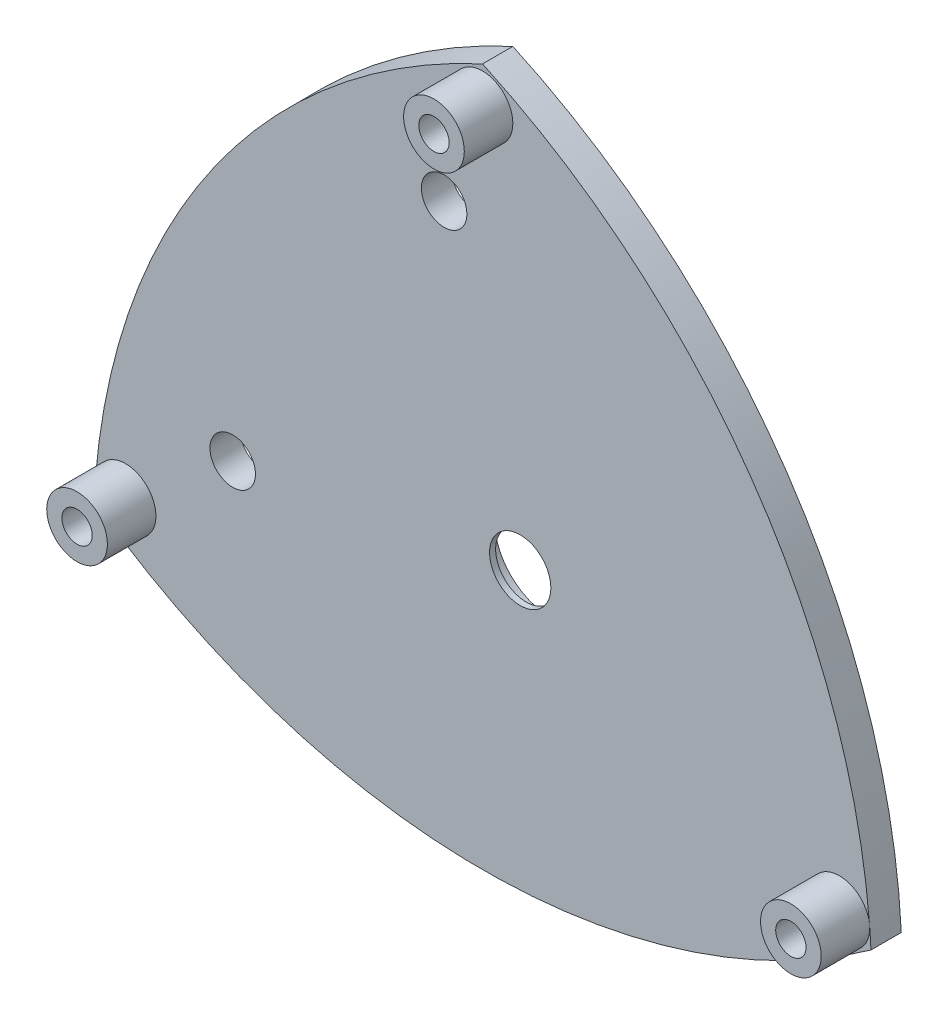
ISO-10303-21;
HEADER;
FILE_DESCRIPTION(('STEP AP214'),'2;1');
FILE_NAME('part.step','',(''),(''),'','','');
FILE_SCHEMA(('AUTOMOTIVE_DESIGN { 1 0 10303 214 1 1 1 1 }'));
ENDSEC;
DATA;
#1=APPLICATION_CONTEXT('core data for automotive mechanical design processes');
#2=APPLICATION_PROTOCOL_DEFINITION('international standard','automotive_design',2000,#1);
#3=PRODUCT_CONTEXT('',#1,'mechanical');
#4=PRODUCT('Part','Part','',(#3));
#5=PRODUCT_RELATED_PRODUCT_CATEGORY('part','',(#4));
#6=PRODUCT_DEFINITION_FORMATION('','',#4);
#7=PRODUCT_DEFINITION_CONTEXT('part definition',#1,'design');
#8=PRODUCT_DEFINITION('design','',#6,#7);
#9=PRODUCT_DEFINITION_SHAPE('','',#8);
#10=(LENGTH_UNIT() NAMED_UNIT(*) SI_UNIT(.MILLI.,.METRE.));
#11=(NAMED_UNIT(*) PLANE_ANGLE_UNIT() SI_UNIT($,.RADIAN.));
#12=(NAMED_UNIT(*) SI_UNIT($,.STERADIAN.) SOLID_ANGLE_UNIT());
#13=UNCERTAINTY_MEASURE_WITH_UNIT(LENGTH_MEASURE(1.E-05),#10,'distance_accuracy_value','');
#14=(GEOMETRIC_REPRESENTATION_CONTEXT(3) GLOBAL_UNCERTAINTY_ASSIGNED_CONTEXT((#13)) GLOBAL_UNIT_ASSIGNED_CONTEXT((#10,
#11,#12)) REPRESENTATION_CONTEXT('',''));
#15=CARTESIAN_POINT('',(0.,0.,0.));
#16=DIRECTION('',(0.,0.,1.));
#17=DIRECTION('',(1.,0.,0.));
#18=AXIS2_PLACEMENT_3D('',#15,#16,#17);
#19=CARTESIAN_POINT('',(12.4253093192256,-23.2965236729717,0.));
#20=DIRECTION('',(0.,0.,1.));
#21=DIRECTION('',(1.,0.,0.));
#22=AXIS2_PLACEMENT_3D('',#19,#20,#21);
#23=CYLINDRICAL_SURFACE('',#22,18.5);
#24=CARTESIAN_POINT('',(12.4253093192256,-23.2965236729717,0.));
#25=DIRECTION('',(0.,0.,1.));
#26=DIRECTION('',(1.,0.,0.));
#27=AXIS2_PLACEMENT_3D('',#24,#25,#26);
#28=CIRCLE('',#27,18.5);
#29=CARTESIAN_POINT('',(30.9253093192256,-23.2965236729717,0.));
#30=VERTEX_POINT('',#29);
#31=EDGE_CURVE('E232',#30,#30,#28,.T.);
#32=ORIENTED_EDGE('',*,*,#31,.F.);
#33=EDGE_LOOP('',(#32));
#34=FACE_BOUND('',#33,.T.);
#35=CARTESIAN_POINT('',(12.4253093192256,-23.2965236729717,8.));
#36=DIRECTION('',(0.,0.,1.));
#37=DIRECTION('',(1.,0.,0.));
#38=AXIS2_PLACEMENT_3D('',#35,#36,#37);
#39=CIRCLE('',#38,18.5);
#40=CARTESIAN_POINT('',(30.9253093192256,-23.2965236729717,8.));
#41=VERTEX_POINT('',#40);
#42=EDGE_CURVE('E11',#41,#41,#39,.F.);
#43=ORIENTED_EDGE('',*,*,#42,.F.);
#44=EDGE_LOOP('',(#43));
#45=FACE_BOUND('',#44,.T.);
#46=ADVANCED_FACE('F36',(#34,#45),#23,.F.);
#47=CARTESIAN_POINT('',(-45.8494592180799,10.0108651432086,10.));
#48=DIRECTION('',(0.,0.,1.));
#49=DIRECTION('',(1.,0.,0.));
#50=AXIS2_PLACEMENT_3D('',#47,#48,#49);
#51=PLANE('',#50);
#52=CARTESIAN_POINT('',(-12.6509950664081,69.5155367413944,10.));
#53=DIRECTION('',(0.,0.,-1.));
#54=DIRECTION('',(-1.,0.,0.));
#55=AXIS2_PLACEMENT_3D('',#52,#53,#54);
#56=CIRCLE('',#55,7.49999999999965);
#57=CARTESIAN_POINT('',(-20.1509950664078,69.5155367413944,10.));
#58=VERTEX_POINT('',#57);
#59=EDGE_CURVE('E223',#58,#58,#56,.T.);
#60=ORIENTED_EDGE('',*,*,#59,.T.);
#61=EDGE_LOOP('',(#60));
#62=FACE_BOUND('',#61,.T.);
#63=CARTESIAN_POINT('',(-82.3341256154467,-39.5307187827282,10.));
#64=DIRECTION('',(0.,0.,-1.));
#65=DIRECTION('',(-1.,0.,0.));
#66=AXIS2_PLACEMENT_3D('',#63,#64,#65);
#67=CIRCLE('',#66,7.50000000000004);
#68=CARTESIAN_POINT('',(-89.8341256154468,-39.5307187827282,10.));
#69=VERTEX_POINT('',#68);
#70=EDGE_CURVE('E231',#69,#69,#67,.T.);
#71=ORIENTED_EDGE('',*,*,#70,.T.);
#72=EDGE_LOOP('',(#71));
#73=FACE_BOUND('',#72,.T.);
#74=CARTESIAN_POINT('',(0.,103.,10.));
#75=DIRECTION('',(0.,0.,1.));
#76=DIRECTION('',(1.,0.,0.));
#77=AXIS2_PLACEMENT_3D('',#74,#75,#76);
#78=CIRCLE('',#77,10.);
#79=CARTESIAN_POINT('',(10.,103.,10.));
#80=VERTEX_POINT('',#79);
#81=EDGE_CURVE('E125',#80,#80,#78,.T.);
#82=ORIENTED_EDGE('',*,*,#81,.F.);
#83=EDGE_LOOP('',(#82));
#84=FACE_BOUND('',#83,.T.);
#85=CARTESIAN_POINT('',(-91.6989184361599,-84.9782697135829,10.));
#86=DIRECTION('',(0.,0.,1.));
#87=DIRECTION('',(1.,0.,0.));
#88=AXIS2_PLACEMENT_3D('',#85,#86,#87);
#89=CIRCLE('',#88,220.);
#90=CARTESIAN_POINT('',(128.022678921713,-73.9139281378286,10.));
#91=VERTEX_POINT('',#90);
#92=CARTESIAN_POINT('',(127.62978060665,-67.804983010433,10.));
#93=VERTEX_POINT('',#92);
#94=EDGE_CURVE('E88',#91,#93,#89,.T.);
#95=ORIENTED_EDGE('',*,*,#94,.T.);
#96=CARTESIAN_POINT('',(117.630374076299,-67.9139281378286,10.));
#97=DIRECTION('',(0.,0.,1.));
#98=DIRECTION('',(1.,0.,0.));
#99=AXIS2_PLACEMENT_3D('',#96,#97,#98);
#100=CIRCLE('',#99,9.99999999999999);
#101=CARTESIAN_POINT('',(127.515403429057,-66.4019113736612,10.));
#102=VERTEX_POINT('',#101);
#103=EDGE_CURVE('E92',#102,#93,#100,.T.);
#104=ORIENTED_EDGE('',*,*,#103,.F.);
#105=CARTESIAN_POINT('',(0.,115.,10.));
#106=VERTEX_POINT('',#105);
#107=EDGE_CURVE('E82',#102,#106,#89,.T.);
#108=ORIENTED_EDGE('',*,*,#107,.T.);
#109=CARTESIAN_POINT('',(91.6989184361599,-84.9782697135829,10.));
#110=DIRECTION('',(0.,0.,1.));
#111=DIRECTION('',(-1.,0.,0.));
#112=AXIS2_PLACEMENT_3D('',#109,#110,#111);
#113=CIRCLE('',#112,220.);
#114=CARTESIAN_POINT('',(-127.515403429057,-66.4019113736612,10.));
#115=VERTEX_POINT('',#114);
#116=EDGE_CURVE('E144',#106,#115,#113,.T.);
#117=ORIENTED_EDGE('',*,*,#116,.T.);
#118=CARTESIAN_POINT('',(-117.630374076299,-67.9139281378286,10.));
#119=DIRECTION('',(0.,0.,1.));
#120=DIRECTION('',(1.,0.,0.));
#121=AXIS2_PLACEMENT_3D('',#118,#119,#120);
#122=CIRCLE('',#121,9.99999999999999);
#123=CARTESIAN_POINT('',(-127.62978060665,-67.804983010433,10.));
#124=VERTEX_POINT('',#123);
#125=EDGE_CURVE('E114',#124,#115,#122,.T.);
#126=ORIENTED_EDGE('',*,*,#125,.F.);
#127=CARTESIAN_POINT('',(-128.022678921713,-73.9139281378286,10.));
#128=VERTEX_POINT('',#127);
#129=EDGE_CURVE('E143',#124,#128,#113,.T.);
#130=ORIENTED_EDGE('',*,*,#129,.T.);
#131=CARTESIAN_POINT('',(0.,105.,10.));
#132=DIRECTION('',(0.,0.,1.));
#133=DIRECTION('',(1.,0.,0.));
#134=AXIS2_PLACEMENT_3D('',#131,#132,#133);
#135=CIRCLE('',#134,220.);
#136=EDGE_CURVE('E89',#128,#91,#135,.T.);
#137=ORIENTED_EDGE('',*,*,#136,.T.);
#138=EDGE_LOOP('',(#95,#104,#108,#117,#126,#130,#137));
#139=FACE_BOUND('',#138,.T.);
#140=CARTESIAN_POINT('',(12.4253093192256,-23.2965236729717,10.));
#141=DIRECTION('',(0.,0.,1.));
#142=DIRECTION('',(1.,0.,0.));
#143=AXIS2_PLACEMENT_3D('',#140,#141,#142);
#144=CIRCLE('',#143,10.1);
#145=CARTESIAN_POINT('',(22.5253093192256,-23.2965236729717,10.));
#146=VERTEX_POINT('',#145);
#147=EDGE_CURVE('E240',#146,#146,#144,.T.);
#148=ORIENTED_EDGE('',*,*,#147,.F.);
#149=EDGE_LOOP('',(#148));
#150=FACE_BOUND('',#149,.T.);
#151=ADVANCED_FACE('F93',(#62,#73,#84,#139,#150),#51,.T.);
#152=CARTESIAN_POINT('',(-45.8494592180799,10.0108651432086,0.));
#153=DIRECTION('',(0.,0.,1.));
#154=DIRECTION('',(1.,0.,0.));
#155=AXIS2_PLACEMENT_3D('',#152,#153,#154);
#156=PLANE('',#155);
#157=ORIENTED_EDGE('',*,*,#31,.T.);
#158=EDGE_LOOP('',(#157));
#159=FACE_BOUND('',#158,.T.);
#160=CARTESIAN_POINT('',(-12.6509950664081,69.5155367413944,0.));
#161=DIRECTION('',(0.,0.,-1.));
#162=DIRECTION('',(-1.,0.,0.));
#163=AXIS2_PLACEMENT_3D('',#160,#161,#162);
#164=CIRCLE('',#163,7.49999999999965);
#165=CARTESIAN_POINT('',(-20.1509950664078,69.5155367413944,0.));
#166=VERTEX_POINT('',#165);
#167=EDGE_CURVE('E225',#166,#166,#164,.T.);
#168=ORIENTED_EDGE('',*,*,#167,.F.);
#169=EDGE_LOOP('',(#168));
#170=FACE_BOUND('',#169,.T.);
#171=CARTESIAN_POINT('',(-82.3341256154467,-39.5307187827282,0.));
#172=DIRECTION('',(0.,0.,-1.));
#173=DIRECTION('',(-1.,0.,0.));
#174=AXIS2_PLACEMENT_3D('',#171,#172,#173);
#175=CIRCLE('',#174,7.50000000000004);
#176=CARTESIAN_POINT('',(-89.8341256154468,-39.5307187827282,0.));
#177=VERTEX_POINT('',#176);
#178=EDGE_CURVE('E228',#177,#177,#175,.T.);
#179=ORIENTED_EDGE('',*,*,#178,.F.);
#180=EDGE_LOOP('',(#179));
#181=FACE_BOUND('',#180,.T.);
#182=CARTESIAN_POINT('',(0.,105.,0.));
#183=DIRECTION('',(0.,0.,1.));
#184=DIRECTION('',(1.,0.,0.));
#185=AXIS2_PLACEMENT_3D('',#182,#183,#184);
#186=CIRCLE('',#185,220.);
#187=CARTESIAN_POINT('',(-128.022678921713,-73.9139281378286,0.));
#188=VERTEX_POINT('',#187);
#189=CARTESIAN_POINT('',(128.022678921713,-73.9139281378286,0.));
#190=VERTEX_POINT('',#189);
#191=EDGE_CURVE('E140',#188,#190,#186,.T.);
#192=ORIENTED_EDGE('',*,*,#191,.F.);
#193=CARTESIAN_POINT('',(91.6989184361599,-84.9782697135829,0.));
#194=DIRECTION('',(0.,0.,1.));
#195=DIRECTION('',(-1.,0.,0.));
#196=AXIS2_PLACEMENT_3D('',#193,#194,#195);
#197=CIRCLE('',#196,220.);
#198=CARTESIAN_POINT('',(0.,115.,0.));
#199=VERTEX_POINT('',#198);
#200=EDGE_CURVE('E141',#199,#188,#197,.T.);
#201=ORIENTED_EDGE('',*,*,#200,.F.);
#202=CARTESIAN_POINT('',(-91.6989184361599,-84.9782697135829,0.));
#203=DIRECTION('',(0.,0.,1.));
#204=DIRECTION('',(1.,0.,0.));
#205=AXIS2_PLACEMENT_3D('',#202,#203,#204);
#206=CIRCLE('',#205,220.);
#207=EDGE_CURVE('E149',#190,#199,#206,.T.);
#208=ORIENTED_EDGE('',*,*,#207,.F.);
#209=EDGE_LOOP('',(#192,#201,#208));
#210=FACE_BOUND('',#209,.T.);
#211=CARTESIAN_POINT('',(-117.630374076299,-67.9139281378286,0.));
#212=DIRECTION('',(0.,0.,1.));
#213=DIRECTION('',(1.,0.,0.));
#214=AXIS2_PLACEMENT_3D('',#211,#212,#213);
#215=CIRCLE('',#214,5.00000000000001);
#216=CARTESIAN_POINT('',(-112.630374076299,-67.9139281378286,0.));
#217=VERTEX_POINT('',#216);
#218=EDGE_CURVE('E137',#217,#217,#215,.T.);
#219=ORIENTED_EDGE('',*,*,#218,.T.);
#220=EDGE_LOOP('',(#219));
#221=FACE_BOUND('',#220,.T.);
#222=CARTESIAN_POINT('',(117.630374076299,-67.9139281378286,0.));
#223=DIRECTION('',(0.,0.,1.));
#224=DIRECTION('',(1.,0.,0.));
#225=AXIS2_PLACEMENT_3D('',#222,#223,#224);
#226=CIRCLE('',#225,5.00000000000001);
#227=CARTESIAN_POINT('',(122.630374076299,-67.9139281378286,0.));
#228=VERTEX_POINT('',#227);
#229=EDGE_CURVE('E134',#228,#228,#226,.T.);
#230=ORIENTED_EDGE('',*,*,#229,.T.);
#231=EDGE_LOOP('',(#230));
#232=FACE_BOUND('',#231,.T.);
#233=CARTESIAN_POINT('',(0.,103.,0.));
#234=DIRECTION('',(0.,0.,1.));
#235=DIRECTION('',(1.,0.,0.));
#236=AXIS2_PLACEMENT_3D('',#233,#234,#235);
#237=CIRCLE('',#236,5.);
#238=CARTESIAN_POINT('',(5.,103.,0.));
#239=VERTEX_POINT('',#238);
#240=EDGE_CURVE('E129',#239,#239,#237,.T.);
#241=ORIENTED_EDGE('',*,*,#240,.T.);
#242=EDGE_LOOP('',(#241));
#243=FACE_BOUND('',#242,.T.);
#244=ADVANCED_FACE('F162',(#159,#170,#181,#210,#221,#232,#243),#156,.F.);
#245=CARTESIAN_POINT('',(0.,105.,10.));
#246=DIRECTION('',(0.,0.,-1.));
#247=DIRECTION('',(-1.,0.,0.));
#248=AXIS2_PLACEMENT_3D('',#245,#246,#247);
#249=CYLINDRICAL_SURFACE('',#248,220.);
#250=ORIENTED_EDGE('',*,*,#191,.T.);
#251=DIRECTION('',(0.,0.,-1.));
#252=VECTOR('',#251,1.);
#253=CARTESIAN_POINT('',(128.022678921713,-73.9139281378286,10.));
#254=LINE('',#253,#252);
#255=EDGE_CURVE('E44',#91,#190,#254,.T.);
#256=ORIENTED_EDGE('',*,*,#255,.F.);
#257=ORIENTED_EDGE('',*,*,#136,.F.);
#258=DIRECTION('',(0.,0.,-1.));
#259=VECTOR('',#258,1.);
#260=CARTESIAN_POINT('',(-128.022678921713,-73.9139281378286,10.));
#261=LINE('',#260,#259);
#262=EDGE_CURVE('E146',#128,#188,#261,.T.);
#263=ORIENTED_EDGE('',*,*,#262,.T.);
#264=EDGE_LOOP('',(#250,#256,#257,#263));
#265=FACE_BOUND('',#264,.T.);
#266=ADVANCED_FACE('F38',(#265),#249,.T.);
#267=CARTESIAN_POINT('',(-91.6989184361599,-84.9782697135829,10.));
#268=DIRECTION('',(0.,0.,-1.));
#269=DIRECTION('',(-1.,0.,0.));
#270=AXIS2_PLACEMENT_3D('',#267,#268,#269);
#271=CYLINDRICAL_SURFACE('',#270,220.);
#272=ORIENTED_EDGE('',*,*,#207,.T.);
#273=DIRECTION('',(0.,0.,-1.));
#274=VECTOR('',#273,1.);
#275=CARTESIAN_POINT('',(0.,115.,10.));
#276=LINE('',#275,#274);
#277=EDGE_CURVE('E86',#106,#199,#276,.T.);
#278=ORIENTED_EDGE('',*,*,#277,.F.);
#279=ORIENTED_EDGE('',*,*,#107,.F.);
#280=CARTESIAN_POINT('',(-91.6989184361599,-84.9782697135829,10.));
#281=DIRECTION('',(0.,0.,1.));
#282=DIRECTION('',(1.,0.,0.));
#283=AXIS2_PLACEMENT_3D('',#280,#281,#282);
#284=CIRCLE('',#283,220.);
#285=EDGE_CURVE('E51',#93,#102,#284,.T.);
#286=ORIENTED_EDGE('',*,*,#285,.F.);
#287=ORIENTED_EDGE('',*,*,#94,.F.);
#288=ORIENTED_EDGE('',*,*,#255,.T.);
#289=EDGE_LOOP('',(#272,#278,#279,#286,#287,#288));
#290=FACE_BOUND('',#289,.T.);
#291=ADVANCED_FACE('F84',(#290),#271,.T.);
#292=CARTESIAN_POINT('',(91.6989184361599,-84.9782697135829,10.));
#293=DIRECTION('',(0.,0.,-1.));
#294=DIRECTION('',(-1.,0.,0.));
#295=AXIS2_PLACEMENT_3D('',#292,#293,#294);
#296=CYLINDRICAL_SURFACE('',#295,220.);
#297=ORIENTED_EDGE('',*,*,#200,.T.);
#298=ORIENTED_EDGE('',*,*,#262,.F.);
#299=ORIENTED_EDGE('',*,*,#129,.F.);
#300=CARTESIAN_POINT('',(91.6989184361599,-84.9782697135829,10.));
#301=DIRECTION('',(0.,0.,1.));
#302=DIRECTION('',(1.,0.,0.));
#303=AXIS2_PLACEMENT_3D('',#300,#301,#302);
#304=CIRCLE('',#303,220.);
#305=EDGE_CURVE('E59',#115,#124,#304,.T.);
#306=ORIENTED_EDGE('',*,*,#305,.F.);
#307=ORIENTED_EDGE('',*,*,#116,.F.);
#308=ORIENTED_EDGE('',*,*,#277,.T.);
#309=EDGE_LOOP('',(#297,#298,#299,#306,#307,#308));
#310=FACE_BOUND('',#309,.T.);
#311=ADVANCED_FACE('F164',(#310),#296,.T.);
#312=CARTESIAN_POINT('',(-117.630374076299,-67.9139281378286,10.));
#313=DIRECTION('',(0.,0.,-1.));
#314=DIRECTION('',(-1.,0.,0.));
#315=AXIS2_PLACEMENT_3D('',#312,#313,#314);
#316=CYLINDRICAL_SURFACE('',#315,5.00000000000001);
#317=ORIENTED_EDGE('',*,*,#218,.F.);
#318=EDGE_LOOP('',(#317));
#319=FACE_BOUND('',#318,.T.);
#320=CARTESIAN_POINT('',(-117.630374076299,-67.9139281378286,26.));
#321=DIRECTION('',(0.,0.,1.));
#322=DIRECTION('',(1.,0.,0.));
#323=AXIS2_PLACEMENT_3D('',#320,#321,#322);
#324=CIRCLE('',#323,5.00000000000001);
#325=CARTESIAN_POINT('',(-112.630374076299,-67.9139281378286,26.));
#326=VERTEX_POINT('',#325);
#327=EDGE_CURVE('E104',#326,#326,#324,.T.);
#328=ORIENTED_EDGE('',*,*,#327,.T.);
#329=EDGE_LOOP('',(#328));
#330=FACE_BOUND('',#329,.T.);
#331=ADVANCED_FACE('F301',(#319,#330),#316,.F.);
#332=CARTESIAN_POINT('',(117.630374076299,-67.9139281378286,10.));
#333=DIRECTION('',(0.,0.,-1.));
#334=DIRECTION('',(-1.,0.,0.));
#335=AXIS2_PLACEMENT_3D('',#332,#333,#334);
#336=CYLINDRICAL_SURFACE('',#335,5.00000000000001);
#337=ORIENTED_EDGE('',*,*,#229,.F.);
#338=EDGE_LOOP('',(#337));
#339=FACE_BOUND('',#338,.T.);
#340=CARTESIAN_POINT('',(117.630374076299,-67.9139281378286,26.));
#341=DIRECTION('',(0.,0.,1.));
#342=DIRECTION('',(1.,0.,0.));
#343=AXIS2_PLACEMENT_3D('',#340,#341,#342);
#344=CIRCLE('',#343,5.00000000000001);
#345=CARTESIAN_POINT('',(122.630374076299,-67.9139281378286,26.));
#346=VERTEX_POINT('',#345);
#347=EDGE_CURVE('E100',#346,#346,#344,.T.);
#348=ORIENTED_EDGE('',*,*,#347,.T.);
#349=EDGE_LOOP('',(#348));
#350=FACE_BOUND('',#349,.T.);
#351=ADVANCED_FACE('F308',(#339,#350),#336,.F.);
#352=CARTESIAN_POINT('',(0.,103.,10.));
#353=DIRECTION('',(0.,0.,-1.));
#354=DIRECTION('',(-1.,0.,0.));
#355=AXIS2_PLACEMENT_3D('',#352,#353,#354);
#356=CYLINDRICAL_SURFACE('',#355,5.);
#357=ORIENTED_EDGE('',*,*,#240,.F.);
#358=EDGE_LOOP('',(#357));
#359=FACE_BOUND('',#358,.T.);
#360=CARTESIAN_POINT('',(0.,103.,26.));
#361=DIRECTION('',(0.,0.,1.));
#362=DIRECTION('',(1.,0.,0.));
#363=AXIS2_PLACEMENT_3D('',#360,#361,#362);
#364=CIRCLE('',#363,5.);
#365=CARTESIAN_POINT('',(5.,103.,26.));
#366=VERTEX_POINT('',#365);
#367=EDGE_CURVE('E122',#366,#366,#364,.T.);
#368=ORIENTED_EDGE('',*,*,#367,.T.);
#369=EDGE_LOOP('',(#368));
#370=FACE_BOUND('',#369,.T.);
#371=ADVANCED_FACE('F316',(#359,#370),#356,.F.);
#372=CARTESIAN_POINT('',(0.,103.,26.));
#373=DIRECTION('',(0.,0.,1.));
#374=DIRECTION('',(1.,0.,0.));
#375=AXIS2_PLACEMENT_3D('',#372,#373,#374);
#376=PLANE('',#375);
#377=CARTESIAN_POINT('',(0.,103.,26.));
#378=DIRECTION('',(0.,0.,1.));
#379=DIRECTION('',(1.,0.,0.));
#380=AXIS2_PLACEMENT_3D('',#377,#378,#379);
#381=CIRCLE('',#380,10.);
#382=CARTESIAN_POINT('',(10.,103.,26.));
#383=VERTEX_POINT('',#382);
#384=EDGE_CURVE('E126',#383,#383,#381,.T.);
#385=ORIENTED_EDGE('',*,*,#384,.T.);
#386=EDGE_LOOP('',(#385));
#387=FACE_BOUND('',#386,.T.);
#388=ORIENTED_EDGE('',*,*,#367,.F.);
#389=EDGE_LOOP('',(#388));
#390=FACE_BOUND('',#389,.T.);
#391=ADVANCED_FACE('F182',(#387,#390),#376,.T.);
#392=CARTESIAN_POINT('',(0.,103.,26.));
#393=DIRECTION('',(0.,0.,-1.));
#394=DIRECTION('',(-1.,0.,0.));
#395=AXIS2_PLACEMENT_3D('',#392,#393,#394);
#396=CYLINDRICAL_SURFACE('',#395,10.);
#397=ORIENTED_EDGE('',*,*,#384,.F.);
#398=EDGE_LOOP('',(#397));
#399=FACE_BOUND('',#398,.T.);
#400=ORIENTED_EDGE('',*,*,#81,.T.);
#401=EDGE_LOOP('',(#400));
#402=FACE_BOUND('',#401,.T.);
#403=ADVANCED_FACE('F174',(#399,#402),#396,.T.);
#404=CARTESIAN_POINT('',(-117.630374076299,-67.9139281378286,10.));
#405=DIRECTION('',(0.,0.,1.));
#406=DIRECTION('',(1.,0.,0.));
#407=AXIS2_PLACEMENT_3D('',#404,#405,#406);
#408=PLANE('',#407);
#409=EDGE_CURVE('E118',#115,#124,#122,.T.);
#410=ORIENTED_EDGE('',*,*,#409,.F.);
#411=ORIENTED_EDGE('',*,*,#305,.T.);
#412=EDGE_LOOP('',(#410,#411));
#413=FACE_BOUND('',#412,.T.);
#414=ADVANCED_FACE('F171',(#413),#408,.F.);
#415=CARTESIAN_POINT('',(-117.630374076299,-67.9139281378286,26.));
#416=DIRECTION('',(0.,0.,1.));
#417=DIRECTION('',(1.,0.,0.));
#418=AXIS2_PLACEMENT_3D('',#415,#416,#417);
#419=PLANE('',#418);
#420=CARTESIAN_POINT('',(-117.630374076299,-67.9139281378286,26.));
#421=DIRECTION('',(0.,0.,1.));
#422=DIRECTION('',(1.,0.,0.));
#423=AXIS2_PLACEMENT_3D('',#420,#421,#422);
#424=CIRCLE('',#423,9.99999999999999);
#425=CARTESIAN_POINT('',(-107.630374076299,-67.9139281378286,26.));
#426=VERTEX_POINT('',#425);
#427=EDGE_CURVE('E115',#426,#426,#424,.T.);
#428=ORIENTED_EDGE('',*,*,#427,.T.);
#429=EDGE_LOOP('',(#428));
#430=FACE_BOUND('',#429,.T.);
#431=ORIENTED_EDGE('',*,*,#327,.F.);
#432=EDGE_LOOP('',(#431));
#433=FACE_BOUND('',#432,.T.);
#434=ADVANCED_FACE('F173',(#430,#433),#419,.T.);
#435=CARTESIAN_POINT('',(-117.630374076299,-67.9139281378286,26.));
#436=DIRECTION('',(0.,0.,-1.));
#437=DIRECTION('',(-1.,0.,0.));
#438=AXIS2_PLACEMENT_3D('',#435,#436,#437);
#439=CYLINDRICAL_SURFACE('',#438,9.99999999999999);
#440=ORIENTED_EDGE('',*,*,#427,.F.);
#441=EDGE_LOOP('',(#440));
#442=FACE_BOUND('',#441,.T.);
#443=ORIENTED_EDGE('',*,*,#409,.T.);
#444=ORIENTED_EDGE('',*,*,#125,.T.);
#445=EDGE_LOOP('',(#443,#444));
#446=FACE_BOUND('',#445,.T.);
#447=ADVANCED_FACE('F169',(#442,#446),#439,.T.);
#448=CARTESIAN_POINT('',(117.630374076299,-67.9139281378286,10.));
#449=DIRECTION('',(0.,0.,1.));
#450=DIRECTION('',(1.,0.,0.));
#451=AXIS2_PLACEMENT_3D('',#448,#449,#450);
#452=PLANE('',#451);
#453=EDGE_CURVE('E99',#93,#102,#100,.T.);
#454=ORIENTED_EDGE('',*,*,#453,.F.);
#455=ORIENTED_EDGE('',*,*,#285,.T.);
#456=EDGE_LOOP('',(#454,#455));
#457=FACE_BOUND('',#456,.T.);
#458=ADVANCED_FACE('F103',(#457),#452,.F.);
#459=CARTESIAN_POINT('',(117.630374076299,-67.9139281378286,26.));
#460=DIRECTION('',(0.,0.,1.));
#461=DIRECTION('',(1.,0.,0.));
#462=AXIS2_PLACEMENT_3D('',#459,#460,#461);
#463=PLANE('',#462);
#464=CARTESIAN_POINT('',(117.630374076299,-67.9139281378286,26.));
#465=DIRECTION('',(0.,0.,1.));
#466=DIRECTION('',(1.,0.,0.));
#467=AXIS2_PLACEMENT_3D('',#464,#465,#466);
#468=CIRCLE('',#467,9.99999999999999);
#469=CARTESIAN_POINT('',(127.630374076299,-67.9139281378286,26.));
#470=VERTEX_POINT('',#469);
#471=EDGE_CURVE('E105',#470,#470,#468,.T.);
#472=ORIENTED_EDGE('',*,*,#471,.T.);
#473=EDGE_LOOP('',(#472));
#474=FACE_BOUND('',#473,.T.);
#475=ORIENTED_EDGE('',*,*,#347,.F.);
#476=EDGE_LOOP('',(#475));
#477=FACE_BOUND('',#476,.T.);
#478=ADVANCED_FACE('F209',(#474,#477),#463,.T.);
#479=CARTESIAN_POINT('',(117.630374076299,-67.9139281378286,26.));
#480=DIRECTION('',(0.,0.,-1.));
#481=DIRECTION('',(-1.,0.,0.));
#482=AXIS2_PLACEMENT_3D('',#479,#480,#481);
#483=CYLINDRICAL_SURFACE('',#482,9.99999999999999);
#484=ORIENTED_EDGE('',*,*,#471,.F.);
#485=EDGE_LOOP('',(#484));
#486=FACE_BOUND('',#485,.T.);
#487=ORIENTED_EDGE('',*,*,#453,.T.);
#488=ORIENTED_EDGE('',*,*,#103,.T.);
#489=EDGE_LOOP('',(#487,#488));
#490=FACE_BOUND('',#489,.T.);
#491=ADVANCED_FACE('F107',(#486,#490),#483,.T.);
#492=CARTESIAN_POINT('',(-82.3341256154467,-39.5307187827282,10.));
#493=DIRECTION('',(0.,0.,-1.));
#494=DIRECTION('',(-1.,0.,0.));
#495=AXIS2_PLACEMENT_3D('',#492,#493,#494);
#496=CYLINDRICAL_SURFACE('',#495,7.50000000000004);
#497=ORIENTED_EDGE('',*,*,#70,.F.);
#498=EDGE_LOOP('',(#497));
#499=FACE_BOUND('',#498,.T.);
#500=ORIENTED_EDGE('',*,*,#178,.T.);
#501=EDGE_LOOP('',(#500));
#502=FACE_BOUND('',#501,.T.);
#503=ADVANCED_FACE('F204',(#499,#502),#496,.F.);
#504=CARTESIAN_POINT('',(-12.6509950664081,69.5155367413944,10.));
#505=DIRECTION('',(0.,0.,-1.));
#506=DIRECTION('',(-1.,0.,0.));
#507=AXIS2_PLACEMENT_3D('',#504,#505,#506);
#508=CYLINDRICAL_SURFACE('',#507,7.49999999999965);
#509=ORIENTED_EDGE('',*,*,#59,.F.);
#510=EDGE_LOOP('',(#509));
#511=FACE_BOUND('',#510,.T.);
#512=ORIENTED_EDGE('',*,*,#167,.T.);
#513=EDGE_LOOP('',(#512));
#514=FACE_BOUND('',#513,.T.);
#515=ADVANCED_FACE('F201',(#511,#514),#508,.F.);
#516=CARTESIAN_POINT('',(12.4253093192256,-23.2965236729717,8.));
#517=DIRECTION('',(0.,0.,1.));
#518=DIRECTION('',(1.,0.,0.));
#519=AXIS2_PLACEMENT_3D('',#516,#517,#518);
#520=PLANE('',#519);
#521=CARTESIAN_POINT('',(12.4253093192256,-23.2965236729717,8.));
#522=DIRECTION('',(0.,0.,1.));
#523=DIRECTION('',(1.,0.,0.));
#524=AXIS2_PLACEMENT_3D('',#521,#522,#523);
#525=CIRCLE('',#524,10.1);
#526=CARTESIAN_POINT('',(22.5253093192256,-23.2965236729717,8.));
#527=VERTEX_POINT('',#526);
#528=EDGE_CURVE('E239',#527,#527,#525,.T.);
#529=ORIENTED_EDGE('',*,*,#528,.T.);
#530=EDGE_LOOP('',(#529));
#531=FACE_BOUND('',#530,.T.);
#532=ORIENTED_EDGE('',*,*,#42,.T.);
#533=EDGE_LOOP('',(#532));
#534=FACE_BOUND('',#533,.T.);
#535=ADVANCED_FACE('F199',(#531,#534),#520,.F.);
#536=CARTESIAN_POINT('',(12.4253093192256,-23.2965236729717,8.));
#537=DIRECTION('',(0.,0.,1.));
#538=DIRECTION('',(1.,0.,0.));
#539=AXIS2_PLACEMENT_3D('',#536,#537,#538);
#540=CYLINDRICAL_SURFACE('',#539,10.1);
#541=ORIENTED_EDGE('',*,*,#528,.F.);
#542=EDGE_LOOP('',(#541));
#543=FACE_BOUND('',#542,.T.);
#544=ORIENTED_EDGE('',*,*,#147,.T.);
#545=EDGE_LOOP('',(#544));
#546=FACE_BOUND('',#545,.T.);
#547=ADVANCED_FACE('F248',(#543,#546),#540,.F.);
#548=CLOSED_SHELL('',(#46,#151,#244,#266,#291,#311,#331,#351,#371,#391,#403,#414,#434,#447,#458,
#478,#491,#503,#515,#535,#547));
#549=MANIFOLD_SOLID_BREP('B2',#548);
#550=ADVANCED_BREP_SHAPE_REPRESENTATION('',(#18,#549),#14);
#551=SHAPE_DEFINITION_REPRESENTATION(#9,#550);
ENDSEC;
END-ISO-10303-21;
